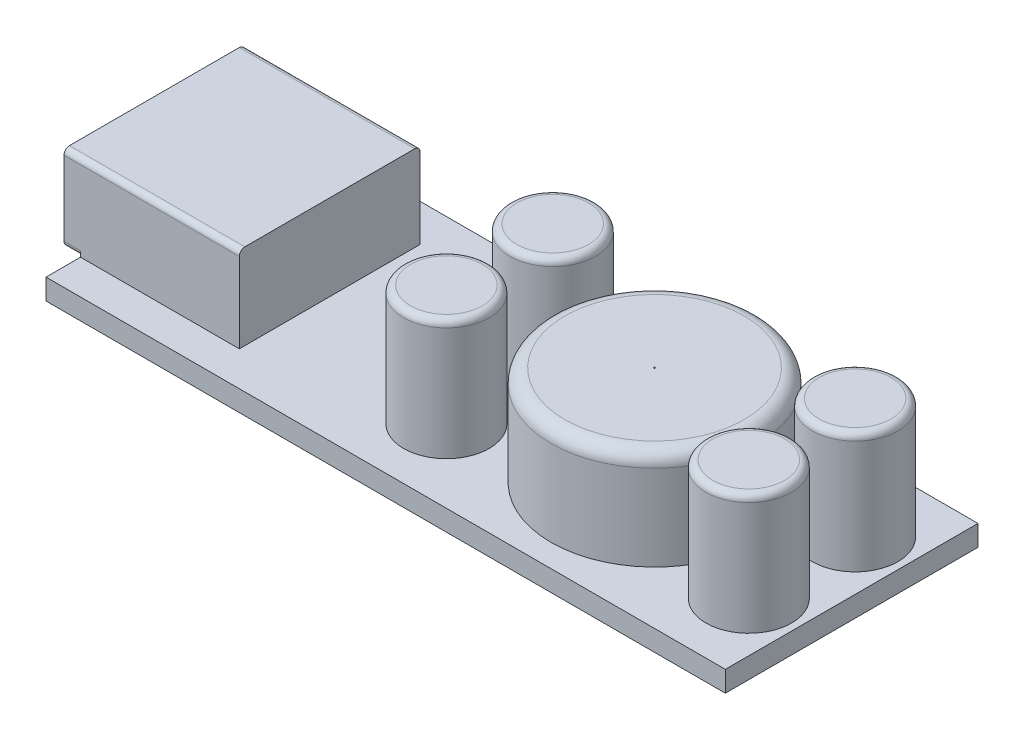
ISO-10303-21;
HEADER;
FILE_DESCRIPTION(('STEP AP214'),'2;1');
FILE_NAME('part.step','',(''),(''),'','','');
FILE_SCHEMA(('AUTOMOTIVE_DESIGN { 1 0 10303 214 1 1 1 1 }'));
ENDSEC;
DATA;
#1=APPLICATION_CONTEXT('core data for automotive mechanical design processes');
#2=APPLICATION_PROTOCOL_DEFINITION('international standard','automotive_design',2000,#1);
#3=PRODUCT_CONTEXT('',#1,'mechanical');
#4=PRODUCT('Part','Part','',(#3));
#5=PRODUCT_RELATED_PRODUCT_CATEGORY('part','',(#4));
#6=PRODUCT_DEFINITION_FORMATION('','',#4);
#7=PRODUCT_DEFINITION_CONTEXT('part definition',#1,'design');
#8=PRODUCT_DEFINITION('design','',#6,#7);
#9=PRODUCT_DEFINITION_SHAPE('','',#8);
#10=(LENGTH_UNIT() NAMED_UNIT(*) SI_UNIT(.MILLI.,.METRE.));
#11=(NAMED_UNIT(*) PLANE_ANGLE_UNIT() SI_UNIT($,.RADIAN.));
#12=(NAMED_UNIT(*) SI_UNIT($,.STERADIAN.) SOLID_ANGLE_UNIT());
#13=UNCERTAINTY_MEASURE_WITH_UNIT(LENGTH_MEASURE(1.E-05),#10,'distance_accuracy_value','');
#14=(GEOMETRIC_REPRESENTATION_CONTEXT(3) GLOBAL_UNCERTAINTY_ASSIGNED_CONTEXT((#13)) GLOBAL_UNIT_ASSIGNED_CONTEXT((#10,
#11,#12)) REPRESENTATION_CONTEXT('',''));
#15=CARTESIAN_POINT('',(0.,0.,0.));
#16=DIRECTION('',(0.,0.,1.));
#17=DIRECTION('',(1.,0.,0.));
#18=AXIS2_PLACEMENT_3D('',#15,#16,#17);
#19=CARTESIAN_POINT('',(0.,0.,0.));
#20=DIRECTION('',(0.,1.,0.));
#21=DIRECTION('',(0.,0.,1.));
#22=AXIS2_PLACEMENT_3D('',#19,#20,#21);
#23=PLANE('',#22);
#24=DIRECTION('',(1.,0.,0.));
#25=VECTOR('',#24,1.);
#26=CARTESIAN_POINT('',(-24.6,0.,-4.4));
#27=LINE('',#26,#25);
#28=CARTESIAN_POINT('',(-24.6,0.,-4.4));
#29=VERTEX_POINT('',#28);
#30=CARTESIAN_POINT('',(-17.4,0.,-4.4));
#31=VERTEX_POINT('',#30);
#32=EDGE_CURVE('E285',#29,#31,#27,.T.);
#33=ORIENTED_EDGE('',*,*,#32,.F.);
#34=DIRECTION('',(0.,0.,1.));
#35=VECTOR('',#34,1.);
#36=CARTESIAN_POINT('',(-24.6,0.,-9.15));
#37=LINE('',#36,#35);
#38=CARTESIAN_POINT('',(-24.6,0.,-9.15));
#39=VERTEX_POINT('',#38);
#40=EDGE_CURVE('E376',#39,#29,#37,.T.);
#41=ORIENTED_EDGE('',*,*,#40,.F.);
#42=DIRECTION('',(-1.,0.,0.));
#43=VECTOR('',#42,1.);
#44=CARTESIAN_POINT('',(-24.6,0.,-9.15));
#45=LINE('',#44,#43);
#46=CARTESIAN_POINT('',(24.6,0.,-9.15));
#47=VERTEX_POINT('',#46);
#48=EDGE_CURVE('E372',#47,#39,#45,.T.);
#49=ORIENTED_EDGE('',*,*,#48,.F.);
#50=DIRECTION('',(0.,0.,-1.));
#51=VECTOR('',#50,1.);
#52=CARTESIAN_POINT('',(24.6,0.,-9.15));
#53=LINE('',#52,#51);
#54=CARTESIAN_POINT('',(24.6,0.,9.15));
#55=VERTEX_POINT('',#54);
#56=EDGE_CURVE('E350',#55,#47,#53,.T.);
#57=ORIENTED_EDGE('',*,*,#56,.F.);
#58=DIRECTION('',(1.,0.,0.));
#59=VECTOR('',#58,1.);
#60=CARTESIAN_POINT('',(-24.6,0.,9.15));
#61=LINE('',#60,#59);
#62=CARTESIAN_POINT('',(-24.6,0.,9.15));
#63=VERTEX_POINT('',#62);
#64=EDGE_CURVE('E356',#63,#55,#61,.T.);
#65=ORIENTED_EDGE('',*,*,#64,.F.);
#66=CARTESIAN_POINT('',(-24.6,0.,4.4));
#67=VERTEX_POINT('',#66);
#68=EDGE_CURVE('E375',#67,#63,#37,.T.);
#69=ORIENTED_EDGE('',*,*,#68,.F.);
#70=DIRECTION('',(-1.,0.,0.));
#71=VECTOR('',#70,1.);
#72=CARTESIAN_POINT('',(-24.6,0.,4.4));
#73=LINE('',#72,#71);
#74=CARTESIAN_POINT('',(-17.4,0.,4.4));
#75=VERTEX_POINT('',#74);
#76=EDGE_CURVE('E293',#75,#67,#73,.T.);
#77=ORIENTED_EDGE('',*,*,#76,.F.);
#78=DIRECTION('',(0.,0.,1.));
#79=VECTOR('',#78,1.);
#80=CARTESIAN_POINT('',(-17.4,0.,4.4));
#81=LINE('',#80,#79);
#82=EDGE_CURVE('E279',#31,#75,#81,.T.);
#83=ORIENTED_EDGE('',*,*,#82,.F.);
#84=EDGE_LOOP('',(#33,#41,#49,#57,#65,#69,#77,#83));
#85=FACE_BOUND('',#84,.T.);
#86=ADVANCED_FACE('F41',(#85),#23,.F.);
#87=CARTESIAN_POINT('',(24.6,1.5,-9.15));
#88=DIRECTION('',(-1.,0.,0.));
#89=DIRECTION('',(0.,0.,1.));
#90=AXIS2_PLACEMENT_3D('',#87,#88,#89);
#91=PLANE('',#90);
#92=ORIENTED_EDGE('',*,*,#56,.T.);
#93=DIRECTION('',(0.,-1.,0.));
#94=VECTOR('',#93,1.);
#95=CARTESIAN_POINT('',(24.6,1.5,-9.15));
#96=LINE('',#95,#94);
#97=CARTESIAN_POINT('',(24.6,1.5,-9.15));
#98=VERTEX_POINT('',#97);
#99=EDGE_CURVE('E336',#98,#47,#96,.T.);
#100=ORIENTED_EDGE('',*,*,#99,.F.);
#101=DIRECTION('',(0.,0.,-1.));
#102=VECTOR('',#101,1.);
#103=CARTESIAN_POINT('',(24.6,1.5,-9.15));
#104=LINE('',#103,#102);
#105=CARTESIAN_POINT('',(24.6,1.5,9.15));
#106=VERTEX_POINT('',#105);
#107=EDGE_CURVE('E351',#106,#98,#104,.T.);
#108=ORIENTED_EDGE('',*,*,#107,.F.);
#109=DIRECTION('',(0.,-1.,0.));
#110=VECTOR('',#109,1.);
#111=CARTESIAN_POINT('',(24.6,1.5,9.15));
#112=LINE('',#111,#110);
#113=EDGE_CURVE('E368',#106,#55,#112,.T.);
#114=ORIENTED_EDGE('',*,*,#113,.T.);
#115=EDGE_LOOP('',(#92,#100,#108,#114));
#116=FACE_BOUND('',#115,.T.);
#117=ADVANCED_FACE('F562',(#116),#91,.F.);
#118=CARTESIAN_POINT('',(-24.6,1.5,-9.15));
#119=DIRECTION('',(0.,0.,1.));
#120=DIRECTION('',(1.,0.,0.));
#121=AXIS2_PLACEMENT_3D('',#118,#119,#120);
#122=PLANE('',#121);
#123=ORIENTED_EDGE('',*,*,#48,.T.);
#124=DIRECTION('',(0.,-1.,0.));
#125=VECTOR('',#124,1.);
#126=CARTESIAN_POINT('',(-24.6,1.5,-9.15));
#127=LINE('',#126,#125);
#128=CARTESIAN_POINT('',(-24.6,1.5,-9.15));
#129=VERTEX_POINT('',#128);
#130=EDGE_CURVE('E389',#129,#39,#127,.T.);
#131=ORIENTED_EDGE('',*,*,#130,.F.);
#132=DIRECTION('',(-1.,0.,0.));
#133=VECTOR('',#132,1.);
#134=CARTESIAN_POINT('',(-24.6,1.5,-9.15));
#135=LINE('',#134,#133);
#136=EDGE_CURVE('E355',#98,#129,#135,.T.);
#137=ORIENTED_EDGE('',*,*,#136,.F.);
#138=ORIENTED_EDGE('',*,*,#99,.T.);
#139=EDGE_LOOP('',(#123,#131,#137,#138));
#140=FACE_BOUND('',#139,.T.);
#141=ADVANCED_FACE('F568',(#140),#122,.F.);
#142=CARTESIAN_POINT('',(-24.6,1.5,-9.15));
#143=DIRECTION('',(1.,0.,0.));
#144=DIRECTION('',(0.,0.,-1.));
#145=AXIS2_PLACEMENT_3D('',#142,#143,#144);
#146=PLANE('',#145);
#147=DIRECTION('',(0.,0.,-1.));
#148=VECTOR('',#147,1.);
#149=CARTESIAN_POINT('',(-24.6,-3.5,4.4));
#150=LINE('',#149,#148);
#151=CARTESIAN_POINT('',(-24.6,-3.5,3.4));
#152=VERTEX_POINT('',#151);
#153=CARTESIAN_POINT('',(-24.6,-3.5,-3.4));
#154=VERTEX_POINT('',#153);
#155=EDGE_CURVE('E284',#152,#154,#150,.T.);
#156=ORIENTED_EDGE('',*,*,#155,.F.);
#157=CARTESIAN_POINT('',(-24.6,-2.5,3.4));
#158=DIRECTION('',(1.,0.,0.));
#159=DIRECTION('',(0.,0.,-1.));
#160=AXIS2_PLACEMENT_3D('',#157,#158,#159);
#161=CIRCLE('',#160,1.);
#162=CARTESIAN_POINT('',(-24.6,-2.5,4.4));
#163=VERTEX_POINT('',#162);
#164=EDGE_CURVE('E406',#152,#163,#161,.F.);
#165=ORIENTED_EDGE('',*,*,#164,.T.);
#166=DIRECTION('',(0.,1.,0.));
#167=VECTOR('',#166,1.);
#168=CARTESIAN_POINT('',(-24.6,-3.5,4.4));
#169=LINE('',#168,#167);
#170=EDGE_CURVE('E305',#163,#67,#169,.T.);
#171=ORIENTED_EDGE('',*,*,#170,.T.);
#172=ORIENTED_EDGE('',*,*,#68,.T.);
#173=DIRECTION('',(0.,-1.,0.));
#174=VECTOR('',#173,1.);
#175=CARTESIAN_POINT('',(-24.6,1.5,9.15));
#176=LINE('',#175,#174);
#177=CARTESIAN_POINT('',(-24.6,1.5,9.15));
#178=VERTEX_POINT('',#177);
#179=EDGE_CURVE('E385',#178,#63,#176,.T.);
#180=ORIENTED_EDGE('',*,*,#179,.F.);
#181=DIRECTION('',(0.,0.,1.));
#182=VECTOR('',#181,1.);
#183=CARTESIAN_POINT('',(-24.6,1.5,-9.15));
#184=LINE('',#183,#182);
#185=CARTESIAN_POINT('',(-24.6,1.5,6.65));
#186=VERTEX_POINT('',#185);
#187=EDGE_CURVE('E359',#186,#178,#184,.T.);
#188=ORIENTED_EDGE('',*,*,#187,.F.);
#189=DIRECTION('',(0.,-1.,0.));
#190=VECTOR('',#189,1.);
#191=CARTESIAN_POINT('',(-24.6,7.7,6.65));
#192=LINE('',#191,#190);
#193=CARTESIAN_POINT('',(-24.6,1.9,6.65));
#194=VERTEX_POINT('',#193);
#195=EDGE_CURVE('E491',#194,#186,#192,.T.);
#196=ORIENTED_EDGE('',*,*,#195,.F.);
#197=CARTESIAN_POINT('',(-24.6,1.9,6.25));
#198=DIRECTION('',(1.,0.,0.));
#199=DIRECTION('',(0.,0.,-1.));
#200=AXIS2_PLACEMENT_3D('',#197,#198,#199);
#201=CIRCLE('',#200,0.4);
#202=CARTESIAN_POINT('',(-24.6,1.5,6.25));
#203=VERTEX_POINT('',#202);
#204=EDGE_CURVE('E50',#194,#203,#201,.T.);
#205=ORIENTED_EDGE('',*,*,#204,.T.);
#206=CARTESIAN_POINT('',(-24.6,1.5,-6.05));
#207=VERTEX_POINT('',#206);
#208=EDGE_CURVE('E365',#207,#203,#184,.T.);
#209=ORIENTED_EDGE('',*,*,#208,.F.);
#210=CARTESIAN_POINT('',(-24.6,1.9,-6.05));
#211=DIRECTION('',(1.,0.,0.));
#212=DIRECTION('',(0.,0.,-1.));
#213=AXIS2_PLACEMENT_3D('',#210,#211,#212);
#214=CIRCLE('',#213,0.4);
#215=CARTESIAN_POINT('',(-24.6,1.9,-6.45));
#216=VERTEX_POINT('',#215);
#217=EDGE_CURVE('E11',#207,#216,#214,.T.);
#218=ORIENTED_EDGE('',*,*,#217,.T.);
#219=DIRECTION('',(0.,1.,0.));
#220=VECTOR('',#219,1.);
#221=CARTESIAN_POINT('',(-24.6,7.7,-6.45));
#222=LINE('',#221,#220);
#223=CARTESIAN_POINT('',(-24.6,1.5,-6.45));
#224=VERTEX_POINT('',#223);
#225=EDGE_CURVE('E56',#224,#216,#222,.T.);
#226=ORIENTED_EDGE('',*,*,#225,.F.);
#227=EDGE_CURVE('E360',#129,#224,#184,.T.);
#228=ORIENTED_EDGE('',*,*,#227,.F.);
#229=ORIENTED_EDGE('',*,*,#130,.T.);
#230=ORIENTED_EDGE('',*,*,#40,.T.);
#231=DIRECTION('',(0.,1.,0.));
#232=VECTOR('',#231,1.);
#233=CARTESIAN_POINT('',(-24.6,-3.5,-4.4));
#234=LINE('',#233,#232);
#235=CARTESIAN_POINT('',(-24.6,-2.5,-4.4));
#236=VERTEX_POINT('',#235);
#237=EDGE_CURVE('E302',#236,#29,#234,.T.);
#238=ORIENTED_EDGE('',*,*,#237,.F.);
#239=CARTESIAN_POINT('',(-24.6,-2.5,-3.4));
#240=DIRECTION('',(1.,0.,0.));
#241=DIRECTION('',(0.,0.,-1.));
#242=AXIS2_PLACEMENT_3D('',#239,#240,#241);
#243=CIRCLE('',#242,1.);
#244=EDGE_CURVE('E403',#236,#154,#243,.F.);
#245=ORIENTED_EDGE('',*,*,#244,.T.);
#246=EDGE_LOOP('',(#156,#165,#171,#172,#180,#188,#196,#205,#209,#218,#226,#228,#229,#230,#238,#245));
#247=FACE_BOUND('',#246,.T.);
#248=ADVANCED_FACE('F519',(#247),#146,.F.);
#249=CARTESIAN_POINT('',(-24.6,1.5,9.15));
#250=DIRECTION('',(0.,0.,-1.));
#251=DIRECTION('',(-1.,0.,0.));
#252=AXIS2_PLACEMENT_3D('',#249,#250,#251);
#253=PLANE('',#252);
#254=ORIENTED_EDGE('',*,*,#64,.T.);
#255=ORIENTED_EDGE('',*,*,#113,.F.);
#256=DIRECTION('',(1.,0.,0.));
#257=VECTOR('',#256,1.);
#258=CARTESIAN_POINT('',(-24.6,1.5,9.15));
#259=LINE('',#258,#257);
#260=EDGE_CURVE('E364',#178,#106,#259,.T.);
#261=ORIENTED_EDGE('',*,*,#260,.F.);
#262=ORIENTED_EDGE('',*,*,#179,.T.);
#263=EDGE_LOOP('',(#254,#255,#261,#262));
#264=FACE_BOUND('',#263,.T.);
#265=ADVANCED_FACE('F576',(#264),#253,.F.);
#266=CARTESIAN_POINT('',(0.,1.5,0.));
#267=DIRECTION('',(0.,1.,0.));
#268=DIRECTION('',(0.,0.,1.));
#269=AXIS2_PLACEMENT_3D('',#266,#267,#268);
#270=PLANE('',#269);
#271=CARTESIAN_POINT('',(10.3244024550917,1.5,0.));
#272=DIRECTION('',(0.,1.,0.));
#273=DIRECTION('',(0.,0.,1.));
#274=AXIS2_PLACEMENT_3D('',#271,#272,#273);
#275=CIRCLE('',#274,7.5);
#276=CARTESIAN_POINT('',(10.3244024550917,1.5,7.5));
#277=VERTEX_POINT('',#276);
#278=EDGE_CURVE('E259',#277,#277,#275,.T.);
#279=ORIENTED_EDGE('',*,*,#278,.F.);
#280=EDGE_LOOP('',(#279));
#281=FACE_BOUND('',#280,.T.);
#282=CARTESIAN_POINT('',(-0.899999999999995,1.5,-3.85));
#283=DIRECTION('',(0.,1.,0.));
#284=DIRECTION('',(0.,0.,1.));
#285=AXIS2_PLACEMENT_3D('',#282,#283,#284);
#286=CIRCLE('',#285,3.1);
#287=CARTESIAN_POINT('',(-0.899999999999995,1.5,-0.749999999999999));
#288=VERTEX_POINT('',#287);
#289=EDGE_CURVE('E263',#288,#288,#286,.T.);
#290=ORIENTED_EDGE('',*,*,#289,.F.);
#291=EDGE_LOOP('',(#290));
#292=FACE_BOUND('',#291,.T.);
#293=CARTESIAN_POINT('',(-0.899999999999995,1.5,3.85));
#294=DIRECTION('',(0.,1.,0.));
#295=DIRECTION('',(0.,0.,1.));
#296=AXIS2_PLACEMENT_3D('',#293,#294,#295);
#297=CIRCLE('',#296,3.1);
#298=CARTESIAN_POINT('',(-0.899999999999995,1.5,6.95));
#299=VERTEX_POINT('',#298);
#300=EDGE_CURVE('E267',#299,#299,#297,.T.);
#301=ORIENTED_EDGE('',*,*,#300,.F.);
#302=EDGE_LOOP('',(#301));
#303=FACE_BOUND('',#302,.T.);
#304=CARTESIAN_POINT('',(21.,1.5,3.85));
#305=DIRECTION('',(0.,1.,0.));
#306=DIRECTION('',(0.,0.,1.));
#307=AXIS2_PLACEMENT_3D('',#304,#305,#306);
#308=CIRCLE('',#307,3.1);
#309=CARTESIAN_POINT('',(21.,1.5,6.95));
#310=VERTEX_POINT('',#309);
#311=EDGE_CURVE('E271',#310,#310,#308,.T.);
#312=ORIENTED_EDGE('',*,*,#311,.F.);
#313=EDGE_LOOP('',(#312));
#314=FACE_BOUND('',#313,.T.);
#315=CARTESIAN_POINT('',(21.,1.5,-3.85));
#316=DIRECTION('',(0.,1.,0.));
#317=DIRECTION('',(0.,0.,1.));
#318=AXIS2_PLACEMENT_3D('',#315,#316,#317);
#319=CIRCLE('',#318,3.1);
#320=CARTESIAN_POINT('',(21.,1.5,-0.75));
#321=VERTEX_POINT('',#320);
#322=EDGE_CURVE('E275',#321,#321,#319,.T.);
#323=ORIENTED_EDGE('',*,*,#322,.F.);
#324=EDGE_LOOP('',(#323));
#325=FACE_BOUND('',#324,.T.);
#326=DIRECTION('',(1.,0.,0.));
#327=VECTOR('',#326,1.);
#328=CARTESIAN_POINT('',(-25.8,1.5,6.65));
#329=LINE('',#328,#327);
#330=CARTESIAN_POINT('',(-13.1,1.5,6.65));
#331=VERTEX_POINT('',#330);
#332=EDGE_CURVE('E331',#186,#331,#329,.T.);
#333=ORIENTED_EDGE('',*,*,#332,.F.);
#334=ORIENTED_EDGE('',*,*,#187,.T.);
#335=ORIENTED_EDGE('',*,*,#260,.T.);
#336=ORIENTED_EDGE('',*,*,#107,.T.);
#337=ORIENTED_EDGE('',*,*,#136,.T.);
#338=ORIENTED_EDGE('',*,*,#227,.T.);
#339=DIRECTION('',(-1.,0.,0.));
#340=VECTOR('',#339,1.);
#341=CARTESIAN_POINT('',(-25.8,1.5,-6.45));
#342=LINE('',#341,#340);
#343=CARTESIAN_POINT('',(-13.1,1.5,-6.45));
#344=VERTEX_POINT('',#343);
#345=EDGE_CURVE('E325',#344,#224,#342,.T.);
#346=ORIENTED_EDGE('',*,*,#345,.F.);
#347=DIRECTION('',(0.,0.,-1.));
#348=VECTOR('',#347,1.);
#349=CARTESIAN_POINT('',(-13.1,1.5,-6.45));
#350=LINE('',#349,#348);
#351=EDGE_CURVE('E311',#331,#344,#350,.T.);
#352=ORIENTED_EDGE('',*,*,#351,.F.);
#353=EDGE_LOOP('',(#333,#334,#335,#336,#337,#338,#346,#352));
#354=FACE_BOUND('',#353,.T.);
#355=ADVANCED_FACE('F574',(#281,#292,#303,#314,#325,#354),#270,.T.);
#356=CARTESIAN_POINT('',(0.,1.5,0.));
#357=DIRECTION('',(0.,1.,0.));
#358=DIRECTION('',(0.,0.,1.));
#359=AXIS2_PLACEMENT_3D('',#356,#357,#358);
#360=PLANE('',#359);
#361=ORIENTED_EDGE('',*,*,#208,.T.);
#362=DIRECTION('',(1.,0.,0.));
#363=VECTOR('',#362,1.);
#364=CARTESIAN_POINT('',(0.,1.5,6.25));
#365=LINE('',#364,#363);
#366=CARTESIAN_POINT('',(-25.8,1.5,6.25));
#367=VERTEX_POINT('',#366);
#368=EDGE_CURVE('E501',#203,#367,#365,.F.);
#369=ORIENTED_EDGE('',*,*,#368,.T.);
#370=DIRECTION('',(0.,0.,1.));
#371=VECTOR('',#370,1.);
#372=CARTESIAN_POINT('',(-25.8,1.5,-6.45));
#373=LINE('',#372,#371);
#374=CARTESIAN_POINT('',(-25.8,1.5,-6.05));
#375=VERTEX_POINT('',#374);
#376=EDGE_CURVE('E317',#375,#367,#373,.T.);
#377=ORIENTED_EDGE('',*,*,#376,.F.);
#378=DIRECTION('',(-1.,0.,0.));
#379=VECTOR('',#378,1.);
#380=CARTESIAN_POINT('',(0.,1.5,-6.05));
#381=LINE('',#380,#379);
#382=EDGE_CURVE('E498',#375,#207,#381,.F.);
#383=ORIENTED_EDGE('',*,*,#382,.T.);
#384=EDGE_LOOP('',(#361,#369,#377,#383));
#385=FACE_BOUND('',#384,.T.);
#386=ADVANCED_FACE('F525',(#385),#360,.F.);
#387=CARTESIAN_POINT('',(-13.1,7.7,-6.45));
#388=DIRECTION('',(-1.,0.,0.));
#389=DIRECTION('',(0.,0.,1.));
#390=AXIS2_PLACEMENT_3D('',#387,#388,#389);
#391=PLANE('',#390);
#392=DIRECTION('',(0.,0.,-1.));
#393=VECTOR('',#392,1.);
#394=CARTESIAN_POINT('',(-13.1,7.7,-6.45));
#395=LINE('',#394,#393);
#396=CARTESIAN_POINT('',(-13.1,7.7,6.25));
#397=VERTEX_POINT('',#396);
#398=CARTESIAN_POINT('',(-13.1,7.7,-6.05));
#399=VERTEX_POINT('',#398);
#400=EDGE_CURVE('E312',#397,#399,#395,.T.);
#401=ORIENTED_EDGE('',*,*,#400,.F.);
#402=CARTESIAN_POINT('',(-13.1,7.3,6.25));
#403=DIRECTION('',(-1.,0.,0.));
#404=DIRECTION('',(0.,0.,1.));
#405=AXIS2_PLACEMENT_3D('',#402,#403,#404);
#406=CIRCLE('',#405,0.4);
#407=CARTESIAN_POINT('',(-13.1,7.3,6.65));
#408=VERTEX_POINT('',#407);
#409=EDGE_CURVE('E432',#397,#408,#406,.F.);
#410=ORIENTED_EDGE('',*,*,#409,.T.);
#411=DIRECTION('',(0.,-1.,0.));
#412=VECTOR('',#411,1.);
#413=CARTESIAN_POINT('',(-13.1,7.7,6.65));
#414=LINE('',#413,#412);
#415=EDGE_CURVE('E321',#408,#331,#414,.T.);
#416=ORIENTED_EDGE('',*,*,#415,.T.);
#417=ORIENTED_EDGE('',*,*,#351,.T.);
#418=DIRECTION('',(0.,-1.,0.));
#419=VECTOR('',#418,1.);
#420=CARTESIAN_POINT('',(-13.1,7.7,-6.45));
#421=LINE('',#420,#419);
#422=CARTESIAN_POINT('',(-13.1,7.3,-6.45));
#423=VERTEX_POINT('',#422);
#424=EDGE_CURVE('E347',#423,#344,#421,.T.);
#425=ORIENTED_EDGE('',*,*,#424,.F.);
#426=CARTESIAN_POINT('',(-13.1,7.3,-6.05));
#427=DIRECTION('',(-1.,0.,0.));
#428=DIRECTION('',(0.,0.,1.));
#429=AXIS2_PLACEMENT_3D('',#426,#427,#428);
#430=CIRCLE('',#429,0.4);
#431=EDGE_CURVE('E429',#423,#399,#430,.F.);
#432=ORIENTED_EDGE('',*,*,#431,.T.);
#433=EDGE_LOOP('',(#401,#410,#416,#417,#425,#432));
#434=FACE_BOUND('',#433,.T.);
#435=ADVANCED_FACE('F699',(#434),#391,.F.);
#436=CARTESIAN_POINT('',(-25.8,7.7,-6.45));
#437=DIRECTION('',(0.,0.,1.));
#438=DIRECTION('',(1.,0.,0.));
#439=AXIS2_PLACEMENT_3D('',#436,#437,#438);
#440=PLANE('',#439);
#441=ORIENTED_EDGE('',*,*,#225,.T.);
#442=DIRECTION('',(-1.,0.,0.));
#443=VECTOR('',#442,1.);
#444=CARTESIAN_POINT('',(-25.8,1.9,-6.45));
#445=LINE('',#444,#443);
#446=CARTESIAN_POINT('',(-25.8,1.9,-6.45));
#447=VERTEX_POINT('',#446);
#448=EDGE_CURVE('E512',#216,#447,#445,.T.);
#449=ORIENTED_EDGE('',*,*,#448,.T.);
#450=DIRECTION('',(0.,-1.,0.));
#451=VECTOR('',#450,1.);
#452=CARTESIAN_POINT('',(-25.8,7.7,-6.45));
#453=LINE('',#452,#451);
#454=CARTESIAN_POINT('',(-25.8,7.3,-6.45));
#455=VERTEX_POINT('',#454);
#456=EDGE_CURVE('E343',#455,#447,#453,.T.);
#457=ORIENTED_EDGE('',*,*,#456,.F.);
#458=DIRECTION('',(-1.,0.,0.));
#459=VECTOR('',#458,1.);
#460=CARTESIAN_POINT('',(-13.1,7.3,-6.45));
#461=LINE('',#460,#459);
#462=EDGE_CURVE('E444',#455,#423,#461,.F.);
#463=ORIENTED_EDGE('',*,*,#462,.T.);
#464=ORIENTED_EDGE('',*,*,#424,.T.);
#465=ORIENTED_EDGE('',*,*,#345,.T.);
#466=EDGE_LOOP('',(#441,#449,#457,#463,#464,#465));
#467=FACE_BOUND('',#466,.T.);
#468=ADVANCED_FACE('F553',(#467),#440,.F.);
#469=CARTESIAN_POINT('',(-25.8,7.7,-6.45));
#470=DIRECTION('',(1.,0.,0.));
#471=DIRECTION('',(0.,0.,-1.));
#472=AXIS2_PLACEMENT_3D('',#469,#470,#471);
#473=PLANE('',#472);
#474=DIRECTION('',(0.,0.,-1.));
#475=VECTOR('',#474,1.);
#476=CARTESIAN_POINT('',(-25.8,6.84732638713554,-6.17151396814186));
#477=LINE('',#476,#475);
#478=CARTESIAN_POINT('',(-25.8,6.84732638713554,6.32848603185814));
#479=VERTEX_POINT('',#478);
#480=CARTESIAN_POINT('',(-25.8,6.84732638713554,-6.17151396814186));
#481=VERTEX_POINT('',#480);
#482=EDGE_CURVE('E241',#479,#481,#477,.T.);
#483=ORIENTED_EDGE('',*,*,#482,.F.);
#484=DIRECTION('',(0.,1.,0.));
#485=VECTOR('',#484,1.);
#486=CARTESIAN_POINT('',(-25.8,1.84732638713554,6.32848603185814));
#487=LINE('',#486,#485);
#488=CARTESIAN_POINT('',(-25.8,1.84732638713554,6.32848603185814));
#489=VERTEX_POINT('',#488);
#490=EDGE_CURVE('E208',#489,#479,#487,.T.);
#491=ORIENTED_EDGE('',*,*,#490,.F.);
#492=DIRECTION('',(0.,0.,1.));
#493=VECTOR('',#492,1.);
#494=CARTESIAN_POINT('',(-25.8,1.84732638713554,-6.17151396814186));
#495=LINE('',#494,#493);
#496=CARTESIAN_POINT('',(-25.8,1.84732638713554,-6.17151396814186));
#497=VERTEX_POINT('',#496);
#498=EDGE_CURVE('E228',#497,#489,#495,.T.);
#499=ORIENTED_EDGE('',*,*,#498,.F.);
#500=DIRECTION('',(0.,-1.,0.));
#501=VECTOR('',#500,1.);
#502=CARTESIAN_POINT('',(-25.8,1.84732638713554,-6.17151396814186));
#503=LINE('',#502,#501);
#504=EDGE_CURVE('E232',#481,#497,#503,.T.);
#505=ORIENTED_EDGE('',*,*,#504,.F.);
#506=EDGE_LOOP('',(#483,#491,#499,#505));
#507=FACE_BOUND('',#506,.T.);
#508=ORIENTED_EDGE('',*,*,#376,.T.);
#509=CARTESIAN_POINT('',(-25.8,1.9,6.25));
#510=DIRECTION('',(1.,0.,0.));
#511=DIRECTION('',(0.,0.,-1.));
#512=AXIS2_PLACEMENT_3D('',#509,#510,#511);
#513=CIRCLE('',#512,0.4);
#514=CARTESIAN_POINT('',(-25.8,1.9,6.65));
#515=VERTEX_POINT('',#514);
#516=EDGE_CURVE('E507',#367,#515,#513,.F.);
#517=ORIENTED_EDGE('',*,*,#516,.T.);
#518=DIRECTION('',(0.,-1.,0.));
#519=VECTOR('',#518,1.);
#520=CARTESIAN_POINT('',(-25.8,7.7,6.65));
#521=LINE('',#520,#519);
#522=CARTESIAN_POINT('',(-25.8,7.3,6.65));
#523=VERTEX_POINT('',#522);
#524=EDGE_CURVE('E339',#523,#515,#521,.T.);
#525=ORIENTED_EDGE('',*,*,#524,.F.);
#526=CARTESIAN_POINT('',(-25.8,7.3,6.25));
#527=DIRECTION('',(1.,0.,0.));
#528=DIRECTION('',(0.,0.,-1.));
#529=AXIS2_PLACEMENT_3D('',#526,#527,#528);
#530=CIRCLE('',#529,0.4);
#531=CARTESIAN_POINT('',(-25.8,7.7,6.25));
#532=VERTEX_POINT('',#531);
#533=EDGE_CURVE('E441',#523,#532,#530,.F.);
#534=ORIENTED_EDGE('',*,*,#533,.T.);
#535=DIRECTION('',(0.,0.,1.));
#536=VECTOR('',#535,1.);
#537=CARTESIAN_POINT('',(-25.8,7.7,-6.45));
#538=LINE('',#537,#536);
#539=CARTESIAN_POINT('',(-25.8,7.7,-6.05));
#540=VERTEX_POINT('',#539);
#541=EDGE_CURVE('E316',#540,#532,#538,.T.);
#542=ORIENTED_EDGE('',*,*,#541,.F.);
#543=CARTESIAN_POINT('',(-25.8,7.3,-6.05));
#544=DIRECTION('',(1.,0.,0.));
#545=DIRECTION('',(0.,0.,-1.));
#546=AXIS2_PLACEMENT_3D('',#543,#544,#545);
#547=CIRCLE('',#546,0.4);
#548=EDGE_CURVE('E438',#540,#455,#547,.F.);
#549=ORIENTED_EDGE('',*,*,#548,.T.);
#550=ORIENTED_EDGE('',*,*,#456,.T.);
#551=CARTESIAN_POINT('',(-25.8,1.9,-6.05));
#552=DIRECTION('',(1.,0.,0.));
#553=DIRECTION('',(0.,0.,-1.));
#554=AXIS2_PLACEMENT_3D('',#551,#552,#553);
#555=CIRCLE('',#554,0.4);
#556=EDGE_CURVE('E504',#447,#375,#555,.F.);
#557=ORIENTED_EDGE('',*,*,#556,.T.);
#558=EDGE_LOOP('',(#508,#517,#525,#534,#542,#549,#550,#557));
#559=FACE_BOUND('',#558,.T.);
#560=ADVANCED_FACE('F533',(#507,#559),#473,.F.);
#561=CARTESIAN_POINT('',(-25.8,7.7,6.65));
#562=DIRECTION('',(0.,0.,-1.));
#563=DIRECTION('',(-1.,0.,0.));
#564=AXIS2_PLACEMENT_3D('',#561,#562,#563);
#565=PLANE('',#564);
#566=ORIENTED_EDGE('',*,*,#524,.T.);
#567=DIRECTION('',(1.,0.,0.));
#568=VECTOR('',#567,1.);
#569=CARTESIAN_POINT('',(-25.8,1.9,6.65));
#570=LINE('',#569,#568);
#571=EDGE_CURVE('E494',#515,#194,#570,.T.);
#572=ORIENTED_EDGE('',*,*,#571,.T.);
#573=ORIENTED_EDGE('',*,*,#195,.T.);
#574=ORIENTED_EDGE('',*,*,#332,.T.);
#575=ORIENTED_EDGE('',*,*,#415,.F.);
#576=DIRECTION('',(1.,0.,0.));
#577=VECTOR('',#576,1.);
#578=CARTESIAN_POINT('',(-25.8,7.3,6.65));
#579=LINE('',#578,#577);
#580=EDGE_CURVE('E435',#408,#523,#579,.F.);
#581=ORIENTED_EDGE('',*,*,#580,.T.);
#582=EDGE_LOOP('',(#566,#572,#573,#574,#575,#581));
#583=FACE_BOUND('',#582,.T.);
#584=ADVANCED_FACE('F536',(#583),#565,.F.);
#585=CARTESIAN_POINT('',(0.,7.7,0.));
#586=DIRECTION('',(0.,1.,0.));
#587=DIRECTION('',(0.,0.,1.));
#588=AXIS2_PLACEMENT_3D('',#585,#586,#587);
#589=PLANE('',#588);
#590=ORIENTED_EDGE('',*,*,#541,.T.);
#591=DIRECTION('',(1.,0.,0.));
#592=VECTOR('',#591,1.);
#593=CARTESIAN_POINT('',(-13.1,7.7,6.25));
#594=LINE('',#593,#592);
#595=EDGE_CURVE('E425',#532,#397,#594,.T.);
#596=ORIENTED_EDGE('',*,*,#595,.T.);
#597=ORIENTED_EDGE('',*,*,#400,.T.);
#598=DIRECTION('',(-1.,0.,0.));
#599=VECTOR('',#598,1.);
#600=CARTESIAN_POINT('',(-25.8,7.7,-6.05));
#601=LINE('',#600,#599);
#602=EDGE_CURVE('E421',#399,#540,#601,.T.);
#603=ORIENTED_EDGE('',*,*,#602,.T.);
#604=EDGE_LOOP('',(#590,#596,#597,#603));
#605=FACE_BOUND('',#604,.T.);
#606=ADVANCED_FACE('F544',(#605),#589,.T.);
#607=CARTESIAN_POINT('',(-17.4,-3.5,4.4));
#608=DIRECTION('',(-1.,0.,0.));
#609=DIRECTION('',(0.,0.,1.));
#610=AXIS2_PLACEMENT_3D('',#607,#608,#609);
#611=PLANE('',#610);
#612=DIRECTION('',(0.,1.,0.));
#613=VECTOR('',#612,1.);
#614=CARTESIAN_POINT('',(-17.4,-3.5,4.4));
#615=LINE('',#614,#613);
#616=CARTESIAN_POINT('',(-17.4,-2.5,4.4));
#617=VERTEX_POINT('',#616);
#618=EDGE_CURVE('E308',#617,#75,#615,.T.);
#619=ORIENTED_EDGE('',*,*,#618,.F.);
#620=CARTESIAN_POINT('',(-17.4,-2.5,3.4));
#621=DIRECTION('',(-1.,0.,0.));
#622=DIRECTION('',(0.,0.,1.));
#623=AXIS2_PLACEMENT_3D('',#620,#621,#622);
#624=CIRCLE('',#623,1.);
#625=CARTESIAN_POINT('',(-17.4,-3.5,3.4));
#626=VERTEX_POINT('',#625);
#627=EDGE_CURVE('E415',#617,#626,#624,.F.);
#628=ORIENTED_EDGE('',*,*,#627,.T.);
#629=DIRECTION('',(0.,0.,1.));
#630=VECTOR('',#629,1.);
#631=CARTESIAN_POINT('',(-17.4,-3.5,4.4));
#632=LINE('',#631,#630);
#633=CARTESIAN_POINT('',(-17.4,-3.5,-3.4));
#634=VERTEX_POINT('',#633);
#635=EDGE_CURVE('E280',#634,#626,#632,.T.);
#636=ORIENTED_EDGE('',*,*,#635,.F.);
#637=CARTESIAN_POINT('',(-17.4,-2.5,-3.4));
#638=DIRECTION('',(-1.,0.,0.));
#639=DIRECTION('',(0.,0.,1.));
#640=AXIS2_PLACEMENT_3D('',#637,#638,#639);
#641=CIRCLE('',#640,1.);
#642=CARTESIAN_POINT('',(-17.4,-2.5,-4.4));
#643=VERTEX_POINT('',#642);
#644=EDGE_CURVE('E412',#634,#643,#641,.F.);
#645=ORIENTED_EDGE('',*,*,#644,.T.);
#646=DIRECTION('',(0.,1.,0.));
#647=VECTOR('',#646,1.);
#648=CARTESIAN_POINT('',(-17.4,-3.5,-4.4));
#649=LINE('',#648,#647);
#650=EDGE_CURVE('E289',#643,#31,#649,.T.);
#651=ORIENTED_EDGE('',*,*,#650,.T.);
#652=ORIENTED_EDGE('',*,*,#82,.T.);
#653=EDGE_LOOP('',(#619,#628,#636,#645,#651,#652));
#654=FACE_BOUND('',#653,.T.);
#655=ADVANCED_FACE('F690',(#654),#611,.F.);
#656=CARTESIAN_POINT('',(-24.6,-3.5,4.4));
#657=DIRECTION('',(0.,0.,-1.));
#658=DIRECTION('',(-1.,0.,0.));
#659=AXIS2_PLACEMENT_3D('',#656,#657,#658);
#660=PLANE('',#659);
#661=ORIENTED_EDGE('',*,*,#170,.F.);
#662=DIRECTION('',(-1.,0.,0.));
#663=VECTOR('',#662,1.);
#664=CARTESIAN_POINT('',(-17.4,-2.5,4.4));
#665=LINE('',#664,#663);
#666=EDGE_CURVE('E409',#163,#617,#665,.F.);
#667=ORIENTED_EDGE('',*,*,#666,.T.);
#668=ORIENTED_EDGE('',*,*,#618,.T.);
#669=ORIENTED_EDGE('',*,*,#76,.T.);
#670=EDGE_LOOP('',(#661,#667,#668,#669));
#671=FACE_BOUND('',#670,.T.);
#672=ADVANCED_FACE('F686',(#671),#660,.F.);
#673=CARTESIAN_POINT('',(-24.6,-3.5,-4.4));
#674=DIRECTION('',(0.,0.,1.));
#675=DIRECTION('',(1.,0.,0.));
#676=AXIS2_PLACEMENT_3D('',#673,#674,#675);
#677=PLANE('',#676);
#678=ORIENTED_EDGE('',*,*,#650,.F.);
#679=DIRECTION('',(1.,0.,0.));
#680=VECTOR('',#679,1.);
#681=CARTESIAN_POINT('',(-24.6,-2.5,-4.4));
#682=LINE('',#681,#680);
#683=EDGE_CURVE('E418',#643,#236,#682,.F.);
#684=ORIENTED_EDGE('',*,*,#683,.T.);
#685=ORIENTED_EDGE('',*,*,#237,.T.);
#686=ORIENTED_EDGE('',*,*,#32,.T.);
#687=EDGE_LOOP('',(#678,#684,#685,#686));
#688=FACE_BOUND('',#687,.T.);
#689=ADVANCED_FACE('F682',(#688),#677,.F.);
#690=CARTESIAN_POINT('',(0.,-3.5,0.));
#691=DIRECTION('',(0.,-1.,0.));
#692=DIRECTION('',(0.,0.,-1.));
#693=AXIS2_PLACEMENT_3D('',#690,#691,#692);
#694=PLANE('',#693);
#695=ORIENTED_EDGE('',*,*,#635,.T.);
#696=DIRECTION('',(-1.,0.,0.));
#697=VECTOR('',#696,1.);
#698=CARTESIAN_POINT('',(-24.6,-3.5,3.4));
#699=LINE('',#698,#697);
#700=EDGE_CURVE('E399',#626,#152,#699,.T.);
#701=ORIENTED_EDGE('',*,*,#700,.T.);
#702=ORIENTED_EDGE('',*,*,#155,.T.);
#703=DIRECTION('',(1.,0.,0.));
#704=VECTOR('',#703,1.);
#705=CARTESIAN_POINT('',(-17.4,-3.5,-3.4));
#706=LINE('',#705,#704);
#707=EDGE_CURVE('E335',#154,#634,#706,.T.);
#708=ORIENTED_EDGE('',*,*,#707,.T.);
#709=EDGE_LOOP('',(#695,#701,#702,#708));
#710=FACE_BOUND('',#709,.T.);
#711=ADVANCED_FACE('F589',(#710),#694,.T.);
#712=CARTESIAN_POINT('',(0.,-2.5,3.4));
#713=DIRECTION('',(1.,0.,0.));
#714=DIRECTION('',(0.,0.,-1.));
#715=AXIS2_PLACEMENT_3D('',#712,#713,#714);
#716=CYLINDRICAL_SURFACE('',#715,1.);
#717=ORIENTED_EDGE('',*,*,#627,.F.);
#718=ORIENTED_EDGE('',*,*,#666,.F.);
#719=ORIENTED_EDGE('',*,*,#164,.F.);
#720=ORIENTED_EDGE('',*,*,#700,.F.);
#721=EDGE_LOOP('',(#717,#718,#719,#720));
#722=FACE_BOUND('',#721,.T.);
#723=ADVANCED_FACE('F585',(#722),#716,.T.);
#724=CARTESIAN_POINT('',(0.,-2.5,-3.40000000000001));
#725=DIRECTION('',(-1.,0.,0.));
#726=DIRECTION('',(0.,0.,1.));
#727=AXIS2_PLACEMENT_3D('',#724,#725,#726);
#728=CYLINDRICAL_SURFACE('',#727,1.);
#729=ORIENTED_EDGE('',*,*,#244,.F.);
#730=ORIENTED_EDGE('',*,*,#683,.F.);
#731=ORIENTED_EDGE('',*,*,#644,.F.);
#732=ORIENTED_EDGE('',*,*,#707,.F.);
#733=EDGE_LOOP('',(#729,#730,#731,#732));
#734=FACE_BOUND('',#733,.T.);
#735=ADVANCED_FACE('F588',(#734),#728,.T.);
#736=CARTESIAN_POINT('',(0.,7.3,6.25));
#737=DIRECTION('',(-1.,0.,0.));
#738=DIRECTION('',(0.,0.,1.));
#739=AXIS2_PLACEMENT_3D('',#736,#737,#738);
#740=CYLINDRICAL_SURFACE('',#739,0.4);
#741=ORIENTED_EDGE('',*,*,#533,.F.);
#742=ORIENTED_EDGE('',*,*,#580,.F.);
#743=ORIENTED_EDGE('',*,*,#409,.F.);
#744=ORIENTED_EDGE('',*,*,#595,.F.);
#745=EDGE_LOOP('',(#741,#742,#743,#744));
#746=FACE_BOUND('',#745,.T.);
#747=ADVANCED_FACE('F540',(#746),#740,.T.);
#748=CARTESIAN_POINT('',(0.,7.3,-6.05));
#749=DIRECTION('',(1.,0.,0.));
#750=DIRECTION('',(0.,0.,-1.));
#751=AXIS2_PLACEMENT_3D('',#748,#749,#750);
#752=CYLINDRICAL_SURFACE('',#751,0.4);
#753=ORIENTED_EDGE('',*,*,#431,.F.);
#754=ORIENTED_EDGE('',*,*,#462,.F.);
#755=ORIENTED_EDGE('',*,*,#548,.F.);
#756=ORIENTED_EDGE('',*,*,#602,.F.);
#757=EDGE_LOOP('',(#753,#754,#755,#756));
#758=FACE_BOUND('',#757,.T.);
#759=ADVANCED_FACE('F549',(#758),#752,.T.);
#760=CARTESIAN_POINT('',(21.,10.2,-3.85));
#761=DIRECTION('',(0.,-1.,0.));
#762=DIRECTION('',(0.,0.,-1.));
#763=AXIS2_PLACEMENT_3D('',#760,#761,#762);
#764=CYLINDRICAL_SURFACE('',#763,3.1);
#765=CARTESIAN_POINT('',(21.,9.7,-3.85));
#766=DIRECTION('',(0.,1.,0.));
#767=DIRECTION('',(0.,0.,1.));
#768=AXIS2_PLACEMENT_3D('',#765,#766,#767);
#769=CIRCLE('',#768,3.1);
#770=CARTESIAN_POINT('',(21.,9.7,-0.75));
#771=VERTEX_POINT('',#770);
#772=EDGE_CURVE('E459',#771,#771,#769,.F.);
#773=ORIENTED_EDGE('',*,*,#772,.T.);
#774=EDGE_LOOP('',(#773));
#775=FACE_BOUND('',#774,.T.);
#776=ORIENTED_EDGE('',*,*,#322,.T.);
#777=EDGE_LOOP('',(#776));
#778=FACE_BOUND('',#777,.T.);
#779=ADVANCED_FACE('F598',(#775,#778),#764,.T.);
#780=CARTESIAN_POINT('',(21.,10.2,-3.85));
#781=DIRECTION('',(0.,1.,0.));
#782=DIRECTION('',(0.,0.,1.));
#783=AXIS2_PLACEMENT_3D('',#780,#781,#782);
#784=PLANE('',#783);
#785=CARTESIAN_POINT('',(21.,10.2,-3.85));
#786=DIRECTION('',(0.,1.,0.));
#787=DIRECTION('',(0.,0.,1.));
#788=AXIS2_PLACEMENT_3D('',#785,#786,#787);
#789=CIRCLE('',#788,2.6);
#790=CARTESIAN_POINT('',(21.,10.2,-1.25));
#791=VERTEX_POINT('',#790);
#792=EDGE_CURVE('E455',#791,#791,#789,.T.);
#793=ORIENTED_EDGE('',*,*,#792,.T.);
#794=EDGE_LOOP('',(#793));
#795=FACE_BOUND('',#794,.T.);
#796=ADVANCED_FACE('F672',(#795),#784,.T.);
#797=CARTESIAN_POINT('',(21.,10.2,3.85));
#798=DIRECTION('',(0.,-1.,0.));
#799=DIRECTION('',(0.,0.,-1.));
#800=AXIS2_PLACEMENT_3D('',#797,#798,#799);
#801=CYLINDRICAL_SURFACE('',#800,3.1);
#802=CARTESIAN_POINT('',(21.,9.7,3.85));
#803=DIRECTION('',(0.,1.,0.));
#804=DIRECTION('',(0.,0.,1.));
#805=AXIS2_PLACEMENT_3D('',#802,#803,#804);
#806=CIRCLE('',#805,3.1);
#807=CARTESIAN_POINT('',(21.,9.7,6.95));
#808=VERTEX_POINT('',#807);
#809=EDGE_CURVE('E467',#808,#808,#806,.F.);
#810=ORIENTED_EDGE('',*,*,#809,.T.);
#811=EDGE_LOOP('',(#810));
#812=FACE_BOUND('',#811,.T.);
#813=ORIENTED_EDGE('',*,*,#311,.T.);
#814=EDGE_LOOP('',(#813));
#815=FACE_BOUND('',#814,.T.);
#816=ADVANCED_FACE('F668',(#812,#815),#801,.T.);
#817=CARTESIAN_POINT('',(21.,10.2,3.85));
#818=DIRECTION('',(0.,1.,0.));
#819=DIRECTION('',(0.,0.,1.));
#820=AXIS2_PLACEMENT_3D('',#817,#818,#819);
#821=PLANE('',#820);
#822=CARTESIAN_POINT('',(21.,10.2,3.85));
#823=DIRECTION('',(0.,1.,0.));
#824=DIRECTION('',(0.,0.,1.));
#825=AXIS2_PLACEMENT_3D('',#822,#823,#824);
#826=CIRCLE('',#825,2.6);
#827=CARTESIAN_POINT('',(21.,10.2,6.45));
#828=VERTEX_POINT('',#827);
#829=EDGE_CURVE('E463',#828,#828,#826,.T.);
#830=ORIENTED_EDGE('',*,*,#829,.T.);
#831=EDGE_LOOP('',(#830));
#832=FACE_BOUND('',#831,.T.);
#833=ADVANCED_FACE('F664',(#832),#821,.T.);
#834=CARTESIAN_POINT('',(-0.899999999999995,10.2,3.85));
#835=DIRECTION('',(0.,-1.,0.));
#836=DIRECTION('',(0.,0.,-1.));
#837=AXIS2_PLACEMENT_3D('',#834,#835,#836);
#838=CYLINDRICAL_SURFACE('',#837,3.1);
#839=CARTESIAN_POINT('',(-0.899999999999995,9.7,3.85));
#840=DIRECTION('',(0.,1.,0.));
#841=DIRECTION('',(0.,0.,1.));
#842=AXIS2_PLACEMENT_3D('',#839,#840,#841);
#843=CIRCLE('',#842,3.1);
#844=CARTESIAN_POINT('',(-0.899999999999995,9.7,6.95));
#845=VERTEX_POINT('',#844);
#846=EDGE_CURVE('E475',#845,#845,#843,.F.);
#847=ORIENTED_EDGE('',*,*,#846,.T.);
#848=EDGE_LOOP('',(#847));
#849=FACE_BOUND('',#848,.T.);
#850=ORIENTED_EDGE('',*,*,#300,.T.);
#851=EDGE_LOOP('',(#850));
#852=FACE_BOUND('',#851,.T.);
#853=ADVANCED_FACE('F660',(#849,#852),#838,.T.);
#854=CARTESIAN_POINT('',(-0.899999999999995,10.2,3.85));
#855=DIRECTION('',(0.,1.,0.));
#856=DIRECTION('',(0.,0.,1.));
#857=AXIS2_PLACEMENT_3D('',#854,#855,#856);
#858=PLANE('',#857);
#859=CARTESIAN_POINT('',(-0.899999999999995,10.2,3.85));
#860=DIRECTION('',(0.,1.,0.));
#861=DIRECTION('',(0.,0.,1.));
#862=AXIS2_PLACEMENT_3D('',#859,#860,#861);
#863=CIRCLE('',#862,2.6);
#864=CARTESIAN_POINT('',(-0.899999999999995,10.2,6.45));
#865=VERTEX_POINT('',#864);
#866=EDGE_CURVE('E471',#865,#865,#863,.T.);
#867=ORIENTED_EDGE('',*,*,#866,.T.);
#868=EDGE_LOOP('',(#867));
#869=FACE_BOUND('',#868,.T.);
#870=ADVANCED_FACE('F656',(#869),#858,.T.);
#871=CARTESIAN_POINT('',(-0.899999999999995,10.2,-3.85));
#872=DIRECTION('',(0.,-1.,0.));
#873=DIRECTION('',(0.,0.,-1.));
#874=AXIS2_PLACEMENT_3D('',#871,#872,#873);
#875=CYLINDRICAL_SURFACE('',#874,3.1);
#876=CARTESIAN_POINT('',(-0.899999999999995,9.7,-3.85));
#877=DIRECTION('',(0.,1.,0.));
#878=DIRECTION('',(0.,0.,1.));
#879=AXIS2_PLACEMENT_3D('',#876,#877,#878);
#880=CIRCLE('',#879,3.1);
#881=CARTESIAN_POINT('',(-0.899999999999995,9.7,-0.749999999999999));
#882=VERTEX_POINT('',#881);
#883=EDGE_CURVE('E451',#882,#882,#880,.F.);
#884=ORIENTED_EDGE('',*,*,#883,.T.);
#885=EDGE_LOOP('',(#884));
#886=FACE_BOUND('',#885,.T.);
#887=ORIENTED_EDGE('',*,*,#289,.T.);
#888=EDGE_LOOP('',(#887));
#889=FACE_BOUND('',#888,.T.);
#890=ADVANCED_FACE('F652',(#886,#889),#875,.T.);
#891=CARTESIAN_POINT('',(-0.899999999999995,10.2,-3.85));
#892=DIRECTION('',(0.,1.,0.));
#893=DIRECTION('',(0.,0.,1.));
#894=AXIS2_PLACEMENT_3D('',#891,#892,#893);
#895=PLANE('',#894);
#896=CARTESIAN_POINT('',(-0.899999999999995,10.2,-3.85));
#897=DIRECTION('',(0.,1.,0.));
#898=DIRECTION('',(0.,0.,1.));
#899=AXIS2_PLACEMENT_3D('',#896,#897,#898);
#900=CIRCLE('',#899,2.6);
#901=CARTESIAN_POINT('',(-0.899999999999995,10.2,-1.25));
#902=VERTEX_POINT('',#901);
#903=EDGE_CURVE('E447',#902,#902,#900,.T.);
#904=ORIENTED_EDGE('',*,*,#903,.T.);
#905=EDGE_LOOP('',(#904));
#906=FACE_BOUND('',#905,.T.);
#907=ADVANCED_FACE('F603',(#906),#895,.T.);
#908=CARTESIAN_POINT('',(-0.899999999999995,9.7,-3.85));
#909=DIRECTION('',(0.,1.,0.));
#910=DIRECTION('',(0.,0.,1.));
#911=AXIS2_PLACEMENT_3D('',#908,#909,#910);
#912=TOROIDAL_SURFACE('',#911,2.6,0.5);
#913=ORIENTED_EDGE('',*,*,#883,.F.);
#914=EDGE_LOOP('',(#913));
#915=FACE_BOUND('',#914,.T.);
#916=ORIENTED_EDGE('',*,*,#903,.F.);
#917=EDGE_LOOP('',(#916));
#918=FACE_BOUND('',#917,.T.);
#919=ADVANCED_FACE('F599',(#915,#918),#912,.T.);
#920=CARTESIAN_POINT('',(21.,9.7,-3.85));
#921=DIRECTION('',(0.,1.,0.));
#922=DIRECTION('',(0.,0.,1.));
#923=AXIS2_PLACEMENT_3D('',#920,#921,#922);
#924=TOROIDAL_SURFACE('',#923,2.6,0.5);
#925=ORIENTED_EDGE('',*,*,#772,.F.);
#926=EDGE_LOOP('',(#925));
#927=FACE_BOUND('',#926,.T.);
#928=ORIENTED_EDGE('',*,*,#792,.F.);
#929=EDGE_LOOP('',(#928));
#930=FACE_BOUND('',#929,.T.);
#931=ADVANCED_FACE('F602',(#927,#930),#924,.T.);
#932=CARTESIAN_POINT('',(21.,9.7,3.85));
#933=DIRECTION('',(0.,1.,0.));
#934=DIRECTION('',(0.,0.,1.));
#935=AXIS2_PLACEMENT_3D('',#932,#933,#934);
#936=TOROIDAL_SURFACE('',#935,2.6,0.5);
#937=ORIENTED_EDGE('',*,*,#809,.F.);
#938=EDGE_LOOP('',(#937));
#939=FACE_BOUND('',#938,.T.);
#940=ORIENTED_EDGE('',*,*,#829,.F.);
#941=EDGE_LOOP('',(#940));
#942=FACE_BOUND('',#941,.T.);
#943=ADVANCED_FACE('F607',(#939,#942),#936,.T.);
#944=CARTESIAN_POINT('',(-0.899999999999995,9.7,3.85));
#945=DIRECTION('',(0.,1.,0.));
#946=DIRECTION('',(0.,0.,1.));
#947=AXIS2_PLACEMENT_3D('',#944,#945,#946);
#948=TOROIDAL_SURFACE('',#947,2.6,0.5);
#949=ORIENTED_EDGE('',*,*,#846,.F.);
#950=EDGE_LOOP('',(#949));
#951=FACE_BOUND('',#950,.T.);
#952=ORIENTED_EDGE('',*,*,#866,.F.);
#953=EDGE_LOOP('',(#952));
#954=FACE_BOUND('',#953,.T.);
#955=ADVANCED_FACE('F611',(#951,#954),#948,.T.);
#956=CARTESIAN_POINT('',(10.3244024550917,8.7,0.));
#957=DIRECTION('',(0.,1.,0.));
#958=DIRECTION('',(0.,0.,1.));
#959=AXIS2_PLACEMENT_3D('',#956,#957,#958);
#960=PLANE('',#959);
#961=CARTESIAN_POINT('',(10.3244024550917,8.7,0.));
#962=DIRECTION('',(0.,1.,0.));
#963=DIRECTION('',(0.,0.,1.));
#964=AXIS2_PLACEMENT_3D('',#961,#962,#963);
#965=CIRCLE('',#964,6.5);
#966=CARTESIAN_POINT('',(10.3244024550917,8.7,6.5));
#967=VERTEX_POINT('',#966);
#968=EDGE_CURVE('E483',#967,#967,#965,.T.);
#969=ORIENTED_EDGE('',*,*,#968,.T.);
#970=EDGE_LOOP('',(#969));
#971=FACE_BOUND('',#970,.T.);
#972=CARTESIAN_POINT('',(10.3244024550917,8.7,0.));
#973=DIRECTION('',(0.,1.,0.));
#974=DIRECTION('',(0.,0.,1.));
#975=AXIS2_PLACEMENT_3D('',#972,#973,#974);
#976=CIRCLE('',#975,0.0535509924269209);
#977=CARTESIAN_POINT('',(10.3244024550917,8.7,0.0535509924269209));
#978=VERTEX_POINT('',#977);
#979=EDGE_CURVE('E250',#978,#978,#976,.T.);
#980=ORIENTED_EDGE('',*,*,#979,.F.);
#981=EDGE_LOOP('',(#980));
#982=FACE_BOUND('',#981,.T.);
#983=ADVANCED_FACE('F615',(#971,#982),#960,.T.);
#984=CARTESIAN_POINT('',(10.3244024550917,8.7,0.));
#985=DIRECTION('',(0.,-1.,0.));
#986=DIRECTION('',(0.,0.,-1.));
#987=AXIS2_PLACEMENT_3D('',#984,#985,#986);
#988=CYLINDRICAL_SURFACE('',#987,7.5);
#989=CARTESIAN_POINT('',(10.3244024550917,7.7,0.));
#990=DIRECTION('',(0.,1.,0.));
#991=DIRECTION('',(0.,0.,1.));
#992=AXIS2_PLACEMENT_3D('',#989,#990,#991);
#993=CIRCLE('',#992,7.5);
#994=CARTESIAN_POINT('',(10.3244024550917,7.7,7.5));
#995=VERTEX_POINT('',#994);
#996=EDGE_CURVE('E487',#995,#995,#993,.F.);
#997=ORIENTED_EDGE('',*,*,#996,.T.);
#998=EDGE_LOOP('',(#997));
#999=FACE_BOUND('',#998,.T.);
#1000=ORIENTED_EDGE('',*,*,#278,.T.);
#1001=EDGE_LOOP('',(#1000));
#1002=FACE_BOUND('',#1001,.T.);
#1003=ADVANCED_FACE('F635',(#999,#1002),#988,.T.);
#1004=CARTESIAN_POINT('',(10.3244024550917,8.7,0.));
#1005=DIRECTION('',(0.,-1.,0.));
#1006=DIRECTION('',(0.,0.,-1.));
#1007=AXIS2_PLACEMENT_3D('',#1004,#1005,#1006);
#1008=CYLINDRICAL_SURFACE('',#1007,0.0535509924269209);
#1009=ORIENTED_EDGE('',*,*,#979,.T.);
#1010=EDGE_LOOP('',(#1009));
#1011=FACE_BOUND('',#1010,.T.);
#1012=CARTESIAN_POINT('',(10.3244024550917,1.5,0.));
#1013=DIRECTION('',(0.,1.,0.));
#1014=DIRECTION('',(0.,0.,1.));
#1015=AXIS2_PLACEMENT_3D('',#1012,#1013,#1014);
#1016=CIRCLE('',#1015,0.0535509924269209);
#1017=CARTESIAN_POINT('',(10.3244024550917,1.5,0.0535509924269209));
#1018=VERTEX_POINT('',#1017);
#1019=EDGE_CURVE('E479',#1018,#1018,#1016,.F.);
#1020=ORIENTED_EDGE('',*,*,#1019,.T.);
#1021=EDGE_LOOP('',(#1020));
#1022=FACE_BOUND('',#1021,.T.);
#1023=ADVANCED_FACE('F627',(#1011,#1022),#1008,.F.);
#1024=ORIENTED_EDGE('',*,*,#1019,.F.);
#1025=EDGE_LOOP('',(#1024));
#1026=FACE_BOUND('',#1025,.T.);
#1027=ADVANCED_FACE('F619',(#1026),#270,.T.);
#1028=CARTESIAN_POINT('',(10.3244024550917,7.7,0.));
#1029=DIRECTION('',(0.,1.,0.));
#1030=DIRECTION('',(0.,0.,1.));
#1031=AXIS2_PLACEMENT_3D('',#1028,#1029,#1030);
#1032=TOROIDAL_SURFACE('',#1031,6.5,1.);
#1033=ORIENTED_EDGE('',*,*,#996,.F.);
#1034=EDGE_LOOP('',(#1033));
#1035=FACE_BOUND('',#1034,.T.);
#1036=ORIENTED_EDGE('',*,*,#968,.F.);
#1037=EDGE_LOOP('',(#1036));
#1038=FACE_BOUND('',#1037,.T.);
#1039=ADVANCED_FACE('F617',(#1035,#1038),#1032,.T.);
#1040=CARTESIAN_POINT('',(-15.6,1.84732638713554,6.32848603185814));
#1041=DIRECTION('',(0.,0.,1.));
#1042=DIRECTION('',(1.,0.,0.));
#1043=AXIS2_PLACEMENT_3D('',#1040,#1041,#1042);
#1044=PLANE('',#1043);
#1045=ORIENTED_EDGE('',*,*,#490,.T.);
#1046=DIRECTION('',(-1.,0.,0.));
#1047=VECTOR('',#1046,1.);
#1048=CARTESIAN_POINT('',(-15.6,6.84732638713554,6.32848603185814));
#1049=LINE('',#1048,#1047);
#1050=CARTESIAN_POINT('',(-15.6,6.84732638713554,6.32848603185814));
#1051=VERTEX_POINT('',#1050);
#1052=EDGE_CURVE('E201',#1051,#479,#1049,.T.);
#1053=ORIENTED_EDGE('',*,*,#1052,.F.);
#1054=DIRECTION('',(0.,1.,0.));
#1055=VECTOR('',#1054,1.);
#1056=CARTESIAN_POINT('',(-15.6,1.84732638713554,6.32848603185814));
#1057=LINE('',#1056,#1055);
#1058=CARTESIAN_POINT('',(-15.6,1.84732638713554,6.32848603185814));
#1059=VERTEX_POINT('',#1058);
#1060=EDGE_CURVE('E205',#1059,#1051,#1057,.T.);
#1061=ORIENTED_EDGE('',*,*,#1060,.F.);
#1062=DIRECTION('',(-1.,0.,0.));
#1063=VECTOR('',#1062,1.);
#1064=CARTESIAN_POINT('',(-15.6,1.84732638713554,6.32848603185814));
#1065=LINE('',#1064,#1063);
#1066=EDGE_CURVE('E247',#1059,#489,#1065,.T.);
#1067=ORIENTED_EDGE('',*,*,#1066,.T.);
#1068=EDGE_LOOP('',(#1045,#1053,#1061,#1067));
#1069=FACE_BOUND('',#1068,.T.);
#1070=ADVANCED_FACE('F203',(#1069),#1044,.F.);
#1071=CARTESIAN_POINT('',(-15.6,1.84732638713554,-6.17151396814186));
#1072=DIRECTION('',(0.,-1.,0.));
#1073=DIRECTION('',(0.,0.,-1.));
#1074=AXIS2_PLACEMENT_3D('',#1071,#1072,#1073);
#1075=PLANE('',#1074);
#1076=ORIENTED_EDGE('',*,*,#498,.T.);
#1077=ORIENTED_EDGE('',*,*,#1066,.F.);
#1078=DIRECTION('',(0.,0.,1.));
#1079=VECTOR('',#1078,1.);
#1080=CARTESIAN_POINT('',(-15.6,1.84732638713554,-6.17151396814186));
#1081=LINE('',#1080,#1079);
#1082=CARTESIAN_POINT('',(-15.6,1.84732638713554,-6.17151396814186));
#1083=VERTEX_POINT('',#1082);
#1084=EDGE_CURVE('E214',#1083,#1059,#1081,.T.);
#1085=ORIENTED_EDGE('',*,*,#1084,.F.);
#1086=DIRECTION('',(-1.,0.,0.));
#1087=VECTOR('',#1086,1.);
#1088=CARTESIAN_POINT('',(-15.6,1.84732638713554,-6.17151396814186));
#1089=LINE('',#1088,#1087);
#1090=EDGE_CURVE('E251',#1083,#497,#1089,.T.);
#1091=ORIENTED_EDGE('',*,*,#1090,.T.);
#1092=EDGE_LOOP('',(#1076,#1077,#1085,#1091));
#1093=FACE_BOUND('',#1092,.T.);
#1094=ADVANCED_FACE('F625',(#1093),#1075,.F.);
#1095=CARTESIAN_POINT('',(-15.6,1.84732638713554,-6.17151396814186));
#1096=DIRECTION('',(0.,0.,-1.));
#1097=DIRECTION('',(-1.,0.,0.));
#1098=AXIS2_PLACEMENT_3D('',#1095,#1096,#1097);
#1099=PLANE('',#1098);
#1100=ORIENTED_EDGE('',*,*,#504,.T.);
#1101=ORIENTED_EDGE('',*,*,#1090,.F.);
#1102=DIRECTION('',(0.,-1.,0.));
#1103=VECTOR('',#1102,1.);
#1104=CARTESIAN_POINT('',(-15.6,1.84732638713554,-6.17151396814186));
#1105=LINE('',#1104,#1103);
#1106=CARTESIAN_POINT('',(-15.6,6.84732638713554,-6.17151396814186));
#1107=VERTEX_POINT('',#1106);
#1108=EDGE_CURVE('E223',#1107,#1083,#1105,.T.);
#1109=ORIENTED_EDGE('',*,*,#1108,.F.);
#1110=DIRECTION('',(-1.,0.,0.));
#1111=VECTOR('',#1110,1.);
#1112=CARTESIAN_POINT('',(-15.6,6.84732638713554,-6.17151396814186));
#1113=LINE('',#1112,#1111);
#1114=EDGE_CURVE('E213',#1107,#481,#1113,.T.);
#1115=ORIENTED_EDGE('',*,*,#1114,.T.);
#1116=EDGE_LOOP('',(#1100,#1101,#1109,#1115));
#1117=FACE_BOUND('',#1116,.T.);
#1118=ADVANCED_FACE('F812',(#1117),#1099,.F.);
#1119=CARTESIAN_POINT('',(-15.6,6.84732638713554,-6.17151396814186));
#1120=DIRECTION('',(0.,1.,0.));
#1121=DIRECTION('',(0.,0.,1.));
#1122=AXIS2_PLACEMENT_3D('',#1119,#1120,#1121);
#1123=PLANE('',#1122);
#1124=ORIENTED_EDGE('',*,*,#482,.T.);
#1125=ORIENTED_EDGE('',*,*,#1114,.F.);
#1126=DIRECTION('',(0.,0.,-1.));
#1127=VECTOR('',#1126,1.);
#1128=CARTESIAN_POINT('',(-15.6,6.84732638713554,-6.17151396814186));
#1129=LINE('',#1128,#1127);
#1130=EDGE_CURVE('E217',#1051,#1107,#1129,.T.);
#1131=ORIENTED_EDGE('',*,*,#1130,.F.);
#1132=ORIENTED_EDGE('',*,*,#1052,.T.);
#1133=EDGE_LOOP('',(#1124,#1125,#1131,#1132));
#1134=FACE_BOUND('',#1133,.T.);
#1135=ADVANCED_FACE('F218',(#1134),#1123,.F.);
#1136=CARTESIAN_POINT('',(-15.6,0.,0.));
#1137=DIRECTION('',(1.,0.,0.));
#1138=DIRECTION('',(0.,0.,-1.));
#1139=AXIS2_PLACEMENT_3D('',#1136,#1137,#1138);
#1140=PLANE('',#1139);
#1141=ORIENTED_EDGE('',*,*,#1060,.T.);
#1142=ORIENTED_EDGE('',*,*,#1130,.T.);
#1143=ORIENTED_EDGE('',*,*,#1108,.T.);
#1144=ORIENTED_EDGE('',*,*,#1084,.T.);
#1145=EDGE_LOOP('',(#1141,#1142,#1143,#1144));
#1146=FACE_BOUND('',#1145,.T.);
#1147=ADVANCED_FACE('F225',(#1146),#1140,.F.);
#1148=CARTESIAN_POINT('',(-25.8,1.9,6.25));
#1149=DIRECTION('',(1.,0.,0.));
#1150=DIRECTION('',(0.,0.,-1.));
#1151=AXIS2_PLACEMENT_3D('',#1148,#1149,#1150);
#1152=CYLINDRICAL_SURFACE('',#1151,0.4);
#1153=ORIENTED_EDGE('',*,*,#516,.F.);
#1154=ORIENTED_EDGE('',*,*,#368,.F.);
#1155=ORIENTED_EDGE('',*,*,#204,.F.);
#1156=ORIENTED_EDGE('',*,*,#571,.F.);
#1157=EDGE_LOOP('',(#1153,#1154,#1155,#1156));
#1158=FACE_BOUND('',#1157,.T.);
#1159=ADVANCED_FACE('F530',(#1158),#1152,.T.);
#1160=CARTESIAN_POINT('',(-25.8,1.9,-6.05));
#1161=DIRECTION('',(-1.,0.,0.));
#1162=DIRECTION('',(0.,0.,1.));
#1163=AXIS2_PLACEMENT_3D('',#1160,#1161,#1162);
#1164=CYLINDRICAL_SURFACE('',#1163,0.4);
#1165=ORIENTED_EDGE('',*,*,#217,.F.);
#1166=ORIENTED_EDGE('',*,*,#382,.F.);
#1167=ORIENTED_EDGE('',*,*,#556,.F.);
#1168=ORIENTED_EDGE('',*,*,#448,.F.);
#1169=EDGE_LOOP('',(#1165,#1166,#1167,#1168));
#1170=FACE_BOUND('',#1169,.T.);
#1171=ADVANCED_FACE('F43',(#1170),#1164,.T.);
#1172=CLOSED_SHELL('',(#86,#117,#141,#248,#265,#355,#386,#435,#468,#560,#584,#606,#655,#672,
#689,#711,#723,#735,#747,#759,#779,#796,#816,#833,#853,#870,#890,#907,#919,#931,#943,#955,#983,
#1003,#1023,#1027,#1039,#1070,#1094,#1118,#1135,#1147,#1159,#1171));
#1173=MANIFOLD_SOLID_BREP('B2',#1172);
#1174=ADVANCED_BREP_SHAPE_REPRESENTATION('',(#18,#1173),#14);
#1175=SHAPE_DEFINITION_REPRESENTATION(#9,#1174);
ENDSEC;
END-ISO-10303-21;
